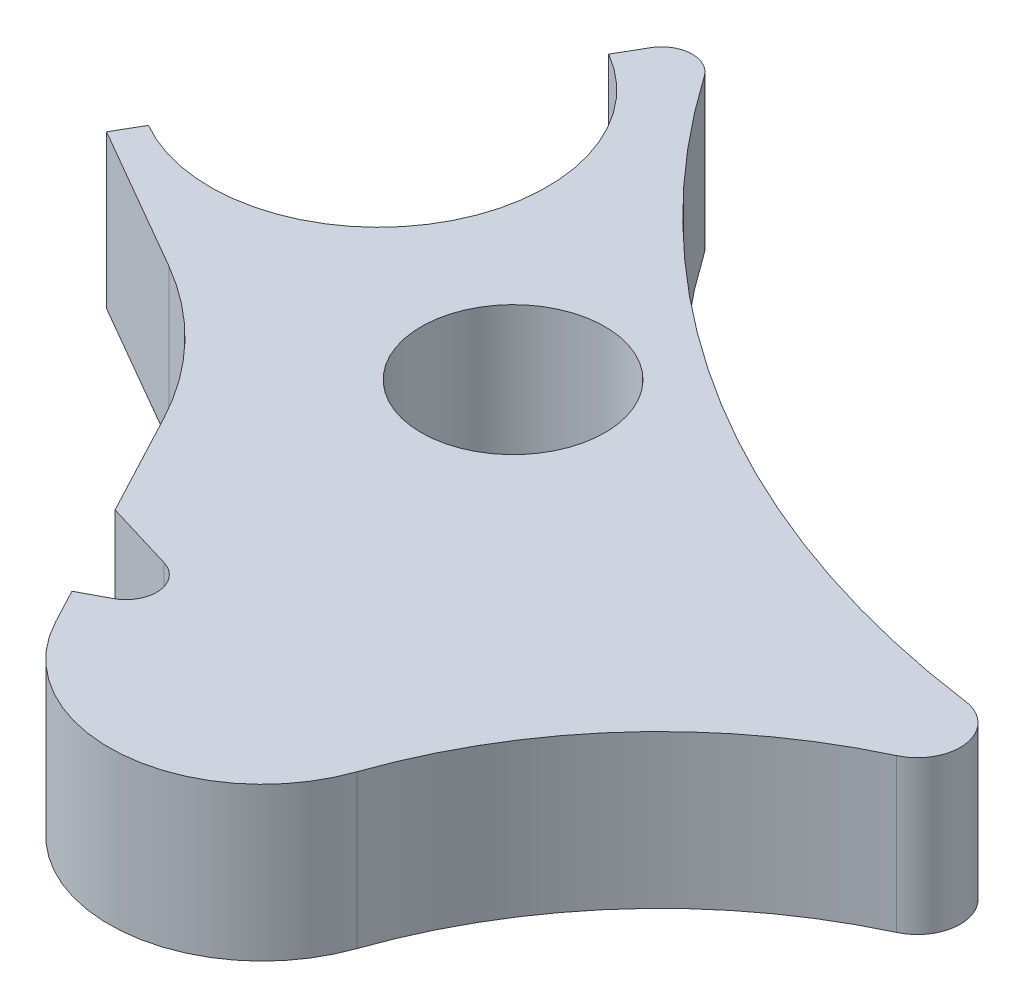
ISO-10303-21;
HEADER;
FILE_DESCRIPTION(('STEP AP214'),'2;1');
FILE_NAME('part.step','',(''),(''),'','','');
FILE_SCHEMA(('AUTOMOTIVE_DESIGN { 1 0 10303 214 1 1 1 1 }'));
ENDSEC;
DATA;
#1=APPLICATION_CONTEXT('core data for automotive mechanical design processes');
#2=APPLICATION_PROTOCOL_DEFINITION('international standard','automotive_design',2000,#1);
#3=PRODUCT_CONTEXT('',#1,'mechanical');
#4=PRODUCT('Part','Part','',(#3));
#5=PRODUCT_RELATED_PRODUCT_CATEGORY('part','',(#4));
#6=PRODUCT_DEFINITION_FORMATION('','',#4);
#7=PRODUCT_DEFINITION_CONTEXT('part definition',#1,'design');
#8=PRODUCT_DEFINITION('design','',#6,#7);
#9=PRODUCT_DEFINITION_SHAPE('','',#8);
#10=(LENGTH_UNIT() NAMED_UNIT(*) SI_UNIT(.MILLI.,.METRE.));
#11=(NAMED_UNIT(*) PLANE_ANGLE_UNIT() SI_UNIT($,.RADIAN.));
#12=(NAMED_UNIT(*) SI_UNIT($,.STERADIAN.) SOLID_ANGLE_UNIT());
#13=UNCERTAINTY_MEASURE_WITH_UNIT(LENGTH_MEASURE(1.E-05),#10,'distance_accuracy_value','');
#14=(GEOMETRIC_REPRESENTATION_CONTEXT(3) GLOBAL_UNCERTAINTY_ASSIGNED_CONTEXT((#13)) GLOBAL_UNIT_ASSIGNED_CONTEXT((#10,
#11,#12)) REPRESENTATION_CONTEXT('',''));
#15=CARTESIAN_POINT('',(0.,0.,0.));
#16=DIRECTION('',(0.,0.,1.));
#17=DIRECTION('',(1.,0.,0.));
#18=AXIS2_PLACEMENT_3D('',#15,#16,#17);
#19=CARTESIAN_POINT('',(-71.6834789839184,12.5,59.6498212203702));
#20=DIRECTION('',(0.,-1.,0.));
#21=DIRECTION('',(0.,0.,-1.));
#22=AXIS2_PLACEMENT_3D('',#19,#20,#21);
#23=CYLINDRICAL_SURFACE('',#22,55.);
#24=CARTESIAN_POINT('',(-71.6834789839184,-12.5,59.6498212203702));
#25=DIRECTION('',(0.,1.,0.));
#26=DIRECTION('',(0.,0.,1.));
#27=AXIS2_PLACEMENT_3D('',#24,#25,#26);
#28=CIRCLE('',#27,55.);
#29=CARTESIAN_POINT('',(-23.0980485474556,-12.5,33.8727781528725));
#30=VERTEX_POINT('',#29);
#31=CARTESIAN_POINT('',(-44.1834789839182,-12.5,12.0184240122262));
#32=VERTEX_POINT('',#31);
#33=EDGE_CURVE('E147',#30,#32,#28,.T.);
#34=ORIENTED_EDGE('',*,*,#33,.F.);
#35=DIRECTION('',(0.,-1.,0.));
#36=VECTOR('',#35,1.);
#37=CARTESIAN_POINT('',(-23.0980485474556,12.5,33.8727781528725));
#38=LINE('',#37,#36);
#39=CARTESIAN_POINT('',(-23.0980485474556,12.5,33.8727781528725));
#40=VERTEX_POINT('',#39);
#41=EDGE_CURVE('E141',#40,#30,#38,.T.);
#42=ORIENTED_EDGE('',*,*,#41,.F.);
#43=CARTESIAN_POINT('',(-71.6834789839184,12.5,59.6498212203702));
#44=DIRECTION('',(0.,1.,0.));
#45=DIRECTION('',(0.,0.,1.));
#46=AXIS2_PLACEMENT_3D('',#43,#44,#45);
#47=CIRCLE('',#46,55.);
#48=CARTESIAN_POINT('',(-44.1834789839182,12.5,12.0184240122262));
#49=VERTEX_POINT('',#48);
#50=EDGE_CURVE('E144',#40,#49,#47,.T.);
#51=ORIENTED_EDGE('',*,*,#50,.T.);
#52=DIRECTION('',(0.,-1.,0.));
#53=VECTOR('',#52,1.);
#54=CARTESIAN_POINT('',(-44.1834789839182,12.5,12.0184240122262));
#55=LINE('',#54,#53);
#56=EDGE_CURVE('E203',#49,#32,#55,.T.);
#57=ORIENTED_EDGE('',*,*,#56,.T.);
#58=EDGE_LOOP('',(#34,#42,#51,#57));
#59=FACE_BOUND('',#58,.T.);
#60=ADVANCED_FACE('F36',(#59),#23,.F.);
#61=CARTESIAN_POINT('',(-32.0482138145933,12.5,17.0032081698954));
#62=DIRECTION('',(0.883371462481142,0.,-0.46867351031814));
#63=DIRECTION('',(-0.46867351031814,0.,-0.883371462481142));
#64=AXIS2_PLACEMENT_3D('',#61,#62,#63);
#65=PLANE('',#64);
#66=DIRECTION('',(0.46867351031814,0.,0.883371462481143));
#67=VECTOR('',#66,1.);
#68=CARTESIAN_POINT('',(-32.0482138145933,-12.5,17.0032081698954));
#69=LINE('',#68,#67);
#70=CARTESIAN_POINT('',(-14.0638768142735,-12.5,50.9006863246606));
#71=VERTEX_POINT('',#70);
#72=EDGE_CURVE('E205',#30,#71,#69,.T.);
#73=ORIENTED_EDGE('',*,*,#72,.T.);
#74=DIRECTION('',(0.,-1.,0.));
#75=VECTOR('',#74,1.);
#76=CARTESIAN_POINT('',(-14.0638768142735,12.5,50.9006863246606));
#77=LINE('',#76,#75);
#78=CARTESIAN_POINT('',(-14.0638768142735,12.5,50.9006863246606));
#79=VERTEX_POINT('',#78);
#80=EDGE_CURVE('E151',#79,#71,#77,.T.);
#81=ORIENTED_EDGE('',*,*,#80,.F.);
#82=DIRECTION('',(0.46867351031814,0.,0.883371462481143));
#83=VECTOR('',#82,1.);
#84=CARTESIAN_POINT('',(-32.0482138145933,12.5,17.0032081698954));
#85=LINE('',#84,#83);
#86=EDGE_CURVE('E154',#40,#79,#85,.T.);
#87=ORIENTED_EDGE('',*,*,#86,.F.);
#88=ORIENTED_EDGE('',*,*,#41,.T.);
#89=EDGE_LOOP('',(#73,#81,#87,#88));
#90=FACE_BOUND('',#89,.T.);
#91=ADVANCED_FACE('F155',(#90),#65,.F.);
#92=CARTESIAN_POINT('',(-15.2694400899056,12.5,50.5364287650806));
#93=DIRECTION('',(0.289233034302246,0.,-0.957258717311217));
#94=DIRECTION('',(-0.957258717311217,0.,-0.289233034302246));
#95=AXIS2_PLACEMENT_3D('',#92,#93,#94);
#96=PLANE('',#95);
#97=DIRECTION('',(0.957258717311217,0.,0.289233034302246));
#98=VECTOR('',#97,1.);
#99=CARTESIAN_POINT('',(-15.2694400899056,-12.5,50.5364287650806));
#100=LINE('',#99,#98);
#101=CARTESIAN_POINT('',(-2.57677220653888,-12.5,54.3714827362875));
#102=VERTEX_POINT('',#101);
#103=EDGE_CURVE('E207',#71,#102,#100,.T.);
#104=ORIENTED_EDGE('',*,*,#103,.T.);
#105=DIRECTION('',(0.,-1.,0.));
#106=VECTOR('',#105,1.);
#107=CARTESIAN_POINT('',(-2.57677220653888,12.5,54.3714827362875));
#108=LINE('',#107,#106);
#109=CARTESIAN_POINT('',(-2.57677220653888,12.5,54.3714827362875));
#110=VERTEX_POINT('',#109);
#111=EDGE_CURVE('E261',#110,#102,#108,.T.);
#112=ORIENTED_EDGE('',*,*,#111,.F.);
#113=DIRECTION('',(0.957258717311217,0.,0.289233034302246));
#114=VECTOR('',#113,1.);
#115=CARTESIAN_POINT('',(-15.2694400899056,12.5,50.5364287650806));
#116=LINE('',#115,#114);
#117=EDGE_CURVE('E159',#79,#110,#116,.T.);
#118=ORIENTED_EDGE('',*,*,#117,.F.);
#119=ORIENTED_EDGE('',*,*,#80,.T.);
#120=EDGE_LOOP('',(#104,#112,#118,#119));
#121=FACE_BOUND('',#120,.T.);
#122=ADVANCED_FACE('F287',(#121),#96,.F.);
#123=CARTESIAN_POINT('',(-4.02293737805009,12.5,59.1577763228436));
#124=DIRECTION('',(0.,-1.,0.));
#125=DIRECTION('',(0.,0.,-1.));
#126=AXIS2_PLACEMENT_3D('',#123,#124,#125);
#127=CYLINDRICAL_SURFACE('',#126,4.99999999999999);
#128=CARTESIAN_POINT('',(-4.02293737805009,-12.5,59.1577763228436));
#129=DIRECTION('',(0.,1.,0.));
#130=DIRECTION('',(0.,0.,1.));
#131=AXIS2_PLACEMENT_3D('',#128,#129,#130);
#132=CIRCLE('',#131,4.99999999999999);
#133=CARTESIAN_POINT('',(-1.67956982645939,-12.5,63.5746336352493));
#134=VERTEX_POINT('',#133);
#135=EDGE_CURVE('E210',#134,#102,#132,.T.);
#136=ORIENTED_EDGE('',*,*,#135,.F.);
#137=DIRECTION('',(0.,-1.,0.));
#138=VECTOR('',#137,1.);
#139=CARTESIAN_POINT('',(-1.67956982645939,12.5,63.5746336352493));
#140=LINE('',#139,#138);
#141=CARTESIAN_POINT('',(-1.67956982645939,12.5,63.5746336352493));
#142=VERTEX_POINT('',#141);
#143=EDGE_CURVE('E259',#142,#134,#140,.T.);
#144=ORIENTED_EDGE('',*,*,#143,.F.);
#145=CARTESIAN_POINT('',(-4.02293737805009,12.5,59.1577763228436));
#146=DIRECTION('',(0.,1.,0.));
#147=DIRECTION('',(0.,0.,1.));
#148=AXIS2_PLACEMENT_3D('',#145,#146,#147);
#149=CIRCLE('',#148,4.99999999999999);
#150=EDGE_CURVE('E173',#142,#110,#149,.T.);
#151=ORIENTED_EDGE('',*,*,#150,.T.);
#152=ORIENTED_EDGE('',*,*,#111,.T.);
#153=EDGE_LOOP('',(#136,#144,#151,#152));
#154=FACE_BOUND('',#153,.T.);
#155=ADVANCED_FACE('F328',(#154),#127,.F.);
#156=CARTESIAN_POINT('',(25.9517866757282,12.5,48.9147930169447));
#157=DIRECTION('',(-0.468673510318138,0.,-0.883371462481143));
#158=DIRECTION('',(-0.883371462481143,0.,0.468673510318138));
#159=AXIS2_PLACEMENT_3D('',#156,#157,#158);
#160=PLANE('',#159);
#161=DIRECTION('',(0.883371462481143,0.,-0.468673510318138));
#162=VECTOR('',#161,1.);
#163=CARTESIAN_POINT('',(25.9517866757282,-12.5,48.9147930169447));
#164=LINE('',#163,#162);
#165=CARTESIAN_POINT('',(-6.0964271388651,-12.5,65.91800118684));
#166=VERTEX_POINT('',#165);
#167=EDGE_CURVE('E213',#166,#134,#164,.T.);
#168=ORIENTED_EDGE('',*,*,#167,.F.);
#169=DIRECTION('',(0.,-1.,0.));
#170=VECTOR('',#169,1.);
#171=CARTESIAN_POINT('',(-6.0964271388651,12.5,65.91800118684));
#172=LINE('',#171,#170);
#173=CARTESIAN_POINT('',(-6.0964271388651,12.5,65.91800118684));
#174=VERTEX_POINT('',#173);
#175=EDGE_CURVE('E257',#174,#166,#172,.T.);
#176=ORIENTED_EDGE('',*,*,#175,.F.);
#177=DIRECTION('',(0.883371462481143,0.,-0.468673510318138));
#178=VECTOR('',#177,1.);
#179=CARTESIAN_POINT('',(25.9517866757282,12.5,48.9147930169447));
#180=LINE('',#179,#178);
#181=EDGE_CURVE('E176',#174,#142,#180,.T.);
#182=ORIENTED_EDGE('',*,*,#181,.T.);
#183=ORIENTED_EDGE('',*,*,#143,.T.);
#184=EDGE_LOOP('',(#168,#176,#182,#183));
#185=FACE_BOUND('',#184,.T.);
#186=ADVANCED_FACE('F294',(#185),#160,.T.);
#187=CARTESIAN_POINT('',(-32.0482138145933,12.5,17.0032081698953));
#188=DIRECTION('',(0.883371462481143,0.,-0.46867351031814));
#189=DIRECTION('',(-0.46867351031814,0.,-0.883371462481143));
#190=AXIS2_PLACEMENT_3D('',#187,#188,#189);
#191=PLANE('',#190);
#192=DIRECTION('',(0.46867351031814,0.,0.883371462481143));
#193=VECTOR('',#192,1.);
#194=CARTESIAN_POINT('',(-32.0482138145933,-12.5,17.0032081698953));
#195=LINE('',#194,#193);
#196=CARTESIAN_POINT('',(-3.01984926989983,-12.5,71.7168377579535));
#197=VERTEX_POINT('',#196);
#198=EDGE_CURVE('E216',#166,#197,#195,.T.);
#199=ORIENTED_EDGE('',*,*,#198,.T.);
#200=DIRECTION('',(0.,-1.,0.));
#201=VECTOR('',#200,1.);
#202=CARTESIAN_POINT('',(-3.01984926989983,12.5,71.7168377579535));
#203=LINE('',#202,#201);
#204=CARTESIAN_POINT('',(-3.01984926989983,12.5,71.7168377579535));
#205=VERTEX_POINT('',#204);
#206=EDGE_CURVE('E254',#205,#197,#203,.T.);
#207=ORIENTED_EDGE('',*,*,#206,.F.);
#208=DIRECTION('',(0.46867351031814,0.,0.883371462481143));
#209=VECTOR('',#208,1.);
#210=CARTESIAN_POINT('',(-32.0482138145933,12.5,17.0032081698953));
#211=LINE('',#210,#209);
#212=EDGE_CURVE('E179',#174,#205,#211,.T.);
#213=ORIENTED_EDGE('',*,*,#212,.F.);
#214=ORIENTED_EDGE('',*,*,#175,.T.);
#215=EDGE_LOOP('',(#199,#207,#213,#214));
#216=FACE_BOUND('',#215,.T.);
#217=ADVANCED_FACE('F300',(#216),#191,.F.);
#218=CARTESIAN_POINT('',(19.0644372921287,12.5,60.));
#219=DIRECTION('',(0.,-1.,0.));
#220=DIRECTION('',(0.,0.,-1.));
#221=AXIS2_PLACEMENT_3D('',#218,#219,#220);
#222=CYLINDRICAL_SURFACE('',#221,25.);
#223=CARTESIAN_POINT('',(19.0644372921287,-12.5,60.));
#224=DIRECTION('',(0.,1.,0.));
#225=DIRECTION('',(0.,0.,1.));
#226=AXIS2_PLACEMENT_3D('',#223,#224,#225);
#227=CIRCLE('',#226,25.);
#228=CARTESIAN_POINT('',(42.6898014399939,-12.5,68.1757060172665));
#229=VERTEX_POINT('',#228);
#230=EDGE_CURVE('E218',#197,#229,#227,.T.);
#231=ORIENTED_EDGE('',*,*,#230,.T.);
#232=DIRECTION('',(0.,-1.,0.));
#233=VECTOR('',#232,1.);
#234=CARTESIAN_POINT('',(42.6898014399939,12.5,68.1757060172665));
#235=LINE('',#234,#233);
#236=CARTESIAN_POINT('',(42.6898014399939,12.5,68.1757060172665));
#237=VERTEX_POINT('',#236);
#238=EDGE_CURVE('E252',#237,#229,#235,.T.);
#239=ORIENTED_EDGE('',*,*,#238,.F.);
#240=CARTESIAN_POINT('',(19.0644372921287,12.5,60.));
#241=DIRECTION('',(0.,1.,0.));
#242=DIRECTION('',(0.,0.,1.));
#243=AXIS2_PLACEMENT_3D('',#240,#241,#242);
#244=CIRCLE('',#243,25.);
#245=EDGE_CURVE('E181',#205,#237,#244,.T.);
#246=ORIENTED_EDGE('',*,*,#245,.F.);
#247=ORIENTED_EDGE('',*,*,#206,.T.);
#248=EDGE_LOOP('',(#231,#239,#246,#247));
#249=FACE_BOUND('',#248,.T.);
#250=ADVANCED_FACE('F305',(#249),#222,.T.);
#251=CARTESIAN_POINT('',(118.290966713162,12.5,94.3379652725194));
#252=DIRECTION('',(0.,-1.,0.));
#253=DIRECTION('',(0.,0.,-1.));
#254=AXIS2_PLACEMENT_3D('',#251,#252,#253);
#255=CYLINDRICAL_SURFACE('',#254,80.);
#256=CARTESIAN_POINT('',(118.290966713162,-12.5,94.3379652725194));
#257=DIRECTION('',(0.,1.,0.));
#258=DIRECTION('',(0.,0.,1.));
#259=AXIS2_PLACEMENT_3D('',#256,#257,#258);
#260=CIRCLE('',#259,80.);
#261=CARTESIAN_POINT('',(84.4601927240476,-12.5,21.8432845621567));
#262=VERTEX_POINT('',#261);
#263=EDGE_CURVE('E221',#262,#229,#260,.T.);
#264=ORIENTED_EDGE('',*,*,#263,.F.);
#265=DIRECTION('',(0.,-1.,0.));
#266=VECTOR('',#265,1.);
#267=CARTESIAN_POINT('',(84.4601927240476,12.5,21.8432845621567));
#268=LINE('',#267,#266);
#269=CARTESIAN_POINT('',(84.4601927240476,12.5,21.8432845621567));
#270=VERTEX_POINT('',#269);
#271=EDGE_CURVE('E250',#270,#262,#268,.T.);
#272=ORIENTED_EDGE('',*,*,#271,.F.);
#273=CARTESIAN_POINT('',(118.290966713162,12.5,94.3379652725194));
#274=DIRECTION('',(0.,1.,0.));
#275=DIRECTION('',(0.,0.,1.));
#276=AXIS2_PLACEMENT_3D('',#273,#274,#275);
#277=CIRCLE('',#276,80.);
#278=EDGE_CURVE('E183',#270,#237,#277,.T.);
#279=ORIENTED_EDGE('',*,*,#278,.T.);
#280=ORIENTED_EDGE('',*,*,#238,.T.);
#281=EDGE_LOOP('',(#264,#272,#279,#280));
#282=FACE_BOUND('',#281,.T.);
#283=ADVANCED_FACE('F309',(#282),#255,.F.);
#284=CARTESIAN_POINT('',(81.5,12.5,15.5));
#285=DIRECTION('',(0.,-1.,0.));
#286=DIRECTION('',(0.,0.,-1.));
#287=AXIS2_PLACEMENT_3D('',#284,#285,#286);
#288=CYLINDRICAL_SURFACE('',#287,7.00000000000003);
#289=CARTESIAN_POINT('',(81.5,-12.5,15.5));
#290=DIRECTION('',(0.,1.,0.));
#291=DIRECTION('',(0.,0.,1.));
#292=AXIS2_PLACEMENT_3D('',#289,#290,#291);
#293=CIRCLE('',#292,7.00000000000003);
#294=CARTESIAN_POINT('',(82.4423736641705,-12.5,8.56372348611456));
#295=VERTEX_POINT('',#294);
#296=EDGE_CURVE('E224',#262,#295,#293,.T.);
#297=ORIENTED_EDGE('',*,*,#296,.T.);
#298=DIRECTION('',(0.,-1.,0.));
#299=VECTOR('',#298,1.);
#300=CARTESIAN_POINT('',(82.4423736641705,12.5,8.56372348611456));
#301=LINE('',#300,#299);
#302=CARTESIAN_POINT('',(82.4423736641705,12.5,8.56372348611456));
#303=VERTEX_POINT('',#302);
#304=EDGE_CURVE('E247',#303,#295,#301,.T.);
#305=ORIENTED_EDGE('',*,*,#304,.F.);
#306=CARTESIAN_POINT('',(81.5,12.5,15.5));
#307=DIRECTION('',(0.,1.,0.));
#308=DIRECTION('',(0.,0.,1.));
#309=AXIS2_PLACEMENT_3D('',#306,#307,#308);
#310=CIRCLE('',#309,7.00000000000003);
#311=EDGE_CURVE('E186',#270,#303,#310,.T.);
#312=ORIENTED_EDGE('',*,*,#311,.F.);
#313=ORIENTED_EDGE('',*,*,#271,.T.);
#314=EDGE_LOOP('',(#297,#305,#312,#313));
#315=FACE_BOUND('',#314,.T.);
#316=ADVANCED_FACE('F314',(#315),#288,.T.);
#317=CARTESIAN_POINT('',(103.982343130924,12.5,-149.979739688408));
#318=DIRECTION('',(0.,-1.,0.));
#319=DIRECTION('',(0.,0.,-1.));
#320=AXIS2_PLACEMENT_3D('',#317,#318,#319);
#321=CYLINDRICAL_SURFACE('',#320,160.);
#322=CARTESIAN_POINT('',(103.982343130924,-12.5,-149.979739688408));
#323=DIRECTION('',(0.,1.,0.));
#324=DIRECTION('',(0.,0.,1.));
#325=AXIS2_PLACEMENT_3D('',#322,#323,#324);
#326=CIRCLE('',#325,160.);
#327=CARTESIAN_POINT('',(-27.2839617128956,-12.5,-58.4966417268212));
#328=VERTEX_POINT('',#327);
#329=EDGE_CURVE('E227',#328,#295,#326,.T.);
#330=ORIENTED_EDGE('',*,*,#329,.F.);
#331=DIRECTION('',(0.,-1.,0.));
#332=VECTOR('',#331,1.);
#333=CARTESIAN_POINT('',(-27.2839617128957,12.5,-58.4966417268212));
#334=LINE('',#333,#332);
#335=CARTESIAN_POINT('',(-27.2839617128956,12.5,-58.4966417268212));
#336=VERTEX_POINT('',#335);
#337=EDGE_CURVE('E44',#328,#336,#334,.F.);
#338=ORIENTED_EDGE('',*,*,#337,.T.);
#339=CARTESIAN_POINT('',(103.982343130924,12.5,-149.979739688408));
#340=DIRECTION('',(0.,1.,0.));
#341=DIRECTION('',(0.,0.,1.));
#342=AXIS2_PLACEMENT_3D('',#339,#340,#341);
#343=CIRCLE('',#342,160.);
#344=EDGE_CURVE('E189',#336,#303,#343,.T.);
#345=ORIENTED_EDGE('',*,*,#344,.T.);
#346=ORIENTED_EDGE('',*,*,#304,.T.);
#347=EDGE_LOOP('',(#330,#338,#345,#346));
#348=FACE_BOUND('',#347,.T.);
#349=ADVANCED_FACE('F341',(#348),#321,.F.);
#350=CARTESIAN_POINT('',(-51.9615242270662,12.5,-30.0000000000005));
#351=DIRECTION('',(0.866025403784435,0.,0.500000000000007));
#352=DIRECTION('',(0.500000000000007,0.,-0.866025403784435));
#353=AXIS2_PLACEMENT_3D('',#350,#351,#352);
#354=PLANE('',#353);
#355=DIRECTION('',(-0.500000000000007,0.,0.866025403784435));
#356=VECTOR('',#355,1.);
#357=CARTESIAN_POINT('',(-51.9615242270662,12.5,-30.0000000000005));
#358=LINE('',#357,#356);
#359=CARTESIAN_POINT('',(-35.7161607581872,12.5,-58.1377949155217));
#360=VERTEX_POINT('',#359);
#361=CARTESIAN_POINT('',(-38.2115242270661,12.5,-53.8156986040722));
#362=VERTEX_POINT('',#361);
#363=EDGE_CURVE('E191',#360,#362,#358,.T.);
#364=ORIENTED_EDGE('',*,*,#363,.F.);
#365=DIRECTION('',(0.,1.,0.));
#366=VECTOR('',#365,1.);
#367=CARTESIAN_POINT('',(-35.7161607581872,-12.5,-58.1377949155217));
#368=LINE('',#367,#366);
#369=CARTESIAN_POINT('',(-35.7161607581872,-12.5,-58.1377949155217));
#370=VERTEX_POINT('',#369);
#371=EDGE_CURVE('E150',#360,#370,#368,.F.);
#372=ORIENTED_EDGE('',*,*,#371,.T.);
#373=DIRECTION('',(-0.500000000000007,0.,0.866025403784435));
#374=VECTOR('',#373,1.);
#375=CARTESIAN_POINT('',(-51.9615242270662,-12.5,-30.0000000000005));
#376=LINE('',#375,#374);
#377=CARTESIAN_POINT('',(-38.2115242270661,-12.5,-53.8156986040722));
#378=VERTEX_POINT('',#377);
#379=EDGE_CURVE('E229',#370,#378,#376,.T.);
#380=ORIENTED_EDGE('',*,*,#379,.T.);
#381=DIRECTION('',(0.,-1.,0.));
#382=VECTOR('',#381,1.);
#383=CARTESIAN_POINT('',(-38.2115242270661,12.5,-53.8156986040722));
#384=LINE('',#383,#382);
#385=EDGE_CURVE('E244',#362,#378,#384,.T.);
#386=ORIENTED_EDGE('',*,*,#385,.F.);
#387=EDGE_LOOP('',(#364,#372,#380,#386));
#388=FACE_BOUND('',#387,.T.);
#389=ADVANCED_FACE('F269',(#388),#354,.F.);
#390=CARTESIAN_POINT('',(-51.9615242270662,12.5,-30.0000000000002));
#391=DIRECTION('',(0.,-1.,0.));
#392=DIRECTION('',(0.,0.,-1.));
#393=AXIS2_PLACEMENT_3D('',#390,#391,#392);
#394=CYLINDRICAL_SURFACE('',#393,27.5);
#395=CARTESIAN_POINT('',(-51.9615242270662,-12.5,-30.0000000000002));
#396=DIRECTION('',(0.,1.,0.));
#397=DIRECTION('',(0.,0.,1.));
#398=AXIS2_PLACEMENT_3D('',#395,#396,#397);
#399=CIRCLE('',#398,27.5);
#400=CARTESIAN_POINT('',(-65.7115242270663,-12.5,-6.18430139592822));
#401=VERTEX_POINT('',#400);
#402=EDGE_CURVE('E231',#401,#378,#399,.T.);
#403=ORIENTED_EDGE('',*,*,#402,.F.);
#404=DIRECTION('',(0.,-1.,0.));
#405=VECTOR('',#404,1.);
#406=CARTESIAN_POINT('',(-65.7115242270663,12.5,-6.18430139592822));
#407=LINE('',#406,#405);
#408=CARTESIAN_POINT('',(-65.7115242270663,12.5,-6.18430139592822));
#409=VERTEX_POINT('',#408);
#410=EDGE_CURVE('E242',#409,#401,#407,.T.);
#411=ORIENTED_EDGE('',*,*,#410,.F.);
#412=CARTESIAN_POINT('',(-51.9615242270662,12.5,-30.0000000000002));
#413=DIRECTION('',(0.,1.,0.));
#414=DIRECTION('',(0.,0.,1.));
#415=AXIS2_PLACEMENT_3D('',#412,#413,#414);
#416=CIRCLE('',#415,27.5);
#417=EDGE_CURVE('E193',#409,#362,#416,.T.);
#418=ORIENTED_EDGE('',*,*,#417,.T.);
#419=ORIENTED_EDGE('',*,*,#385,.T.);
#420=EDGE_LOOP('',(#403,#411,#418,#419));
#421=FACE_BOUND('',#420,.T.);
#422=ADVANCED_FACE('F278',(#421),#394,.F.);
#423=CARTESIAN_POINT('',(-51.961524227066,12.5,-30.0000000000003));
#424=DIRECTION('',(-0.866025403784435,0.,-0.500000000000006));
#425=DIRECTION('',(-0.500000000000006,0.,0.866025403784435));
#426=AXIS2_PLACEMENT_3D('',#423,#424,#425);
#427=PLANE('',#426);
#428=DIRECTION('',(0.500000000000006,0.,-0.866025403784435));
#429=VECTOR('',#428,1.);
#430=CARTESIAN_POINT('',(-51.961524227066,-12.5,-30.0000000000003));
#431=LINE('',#430,#429);
#432=CARTESIAN_POINT('',(-68.2115242270663,-12.5,-1.85417437700604));
#433=VERTEX_POINT('',#432);
#434=EDGE_CURVE('E234',#433,#401,#431,.T.);
#435=ORIENTED_EDGE('',*,*,#434,.F.);
#436=DIRECTION('',(0.,-1.,0.));
#437=VECTOR('',#436,1.);
#438=CARTESIAN_POINT('',(-68.2115242270663,12.5,-1.85417437700604));
#439=LINE('',#438,#437);
#440=CARTESIAN_POINT('',(-68.2115242270663,12.5,-1.85417437700604));
#441=VERTEX_POINT('',#440);
#442=EDGE_CURVE('E240',#441,#433,#439,.T.);
#443=ORIENTED_EDGE('',*,*,#442,.F.);
#444=DIRECTION('',(0.500000000000006,0.,-0.866025403784435));
#445=VECTOR('',#444,1.);
#446=CARTESIAN_POINT('',(-51.961524227066,12.5,-30.0000000000003));
#447=LINE('',#446,#445);
#448=EDGE_CURVE('E196',#441,#409,#447,.T.);
#449=ORIENTED_EDGE('',*,*,#448,.T.);
#450=ORIENTED_EDGE('',*,*,#410,.T.);
#451=EDGE_LOOP('',(#435,#443,#449,#450));
#452=FACE_BOUND('',#451,.T.);
#453=ADVANCED_FACE('F281',(#452),#427,.T.);
#454=CARTESIAN_POINT('',(-16.2500000000001,12.5,28.1458256229942));
#455=DIRECTION('',(-0.500000000000004,0.,0.866025403784436));
#456=DIRECTION('',(0.866025403784436,0.,0.500000000000004));
#457=AXIS2_PLACEMENT_3D('',#454,#455,#456);
#458=PLANE('',#457);
#459=DIRECTION('',(-0.866025403784436,0.,-0.500000000000004));
#460=VECTOR('',#459,1.);
#461=CARTESIAN_POINT('',(-16.2500000000001,-12.5,28.1458256229942));
#462=LINE('',#461,#460);
#463=EDGE_CURVE('E169',#32,#433,#462,.T.);
#464=ORIENTED_EDGE('',*,*,#463,.F.);
#465=ORIENTED_EDGE('',*,*,#56,.F.);
#466=DIRECTION('',(-0.866025403784436,0.,-0.500000000000004));
#467=VECTOR('',#466,1.);
#468=CARTESIAN_POINT('',(-16.2500000000001,12.5,28.1458256229942));
#469=LINE('',#468,#467);
#470=EDGE_CURVE('E165',#49,#441,#469,.T.);
#471=ORIENTED_EDGE('',*,*,#470,.T.);
#472=ORIENTED_EDGE('',*,*,#442,.T.);
#473=EDGE_LOOP('',(#464,#465,#471,#472));
#474=FACE_BOUND('',#473,.T.);
#475=ADVANCED_FACE('F284',(#474),#458,.T.);
#476=CARTESIAN_POINT('',(0.,12.5,0.));
#477=DIRECTION('',(0.,-1.,0.));
#478=DIRECTION('',(0.,0.,-1.));
#479=AXIS2_PLACEMENT_3D('',#476,#477,#478);
#480=CYLINDRICAL_SURFACE('',#479,15.);
#481=CARTESIAN_POINT('',(0.,12.5,0.));
#482=DIRECTION('',(0.,1.,0.));
#483=DIRECTION('',(0.,0.,1.));
#484=AXIS2_PLACEMENT_3D('',#481,#482,#483);
#485=CIRCLE('',#484,15.);
#486=CARTESIAN_POINT('',(0.,12.5,15.));
#487=VERTEX_POINT('',#486);
#488=EDGE_CURVE('E200',#487,#487,#485,.T.);
#489=ORIENTED_EDGE('',*,*,#488,.T.);
#490=EDGE_LOOP('',(#489));
#491=FACE_BOUND('',#490,.T.);
#492=CARTESIAN_POINT('',(0.,-12.5,0.));
#493=DIRECTION('',(0.,1.,0.));
#494=DIRECTION('',(0.,0.,1.));
#495=AXIS2_PLACEMENT_3D('',#492,#493,#494);
#496=CIRCLE('',#495,15.);
#497=CARTESIAN_POINT('',(0.,-12.5,15.));
#498=VERTEX_POINT('',#497);
#499=EDGE_CURVE('E166',#498,#498,#496,.T.);
#500=ORIENTED_EDGE('',*,*,#499,.F.);
#501=EDGE_LOOP('',(#500));
#502=FACE_BOUND('',#501,.T.);
#503=ADVANCED_FACE('F352',(#491,#502),#480,.F.);
#504=CARTESIAN_POINT('',(0.,12.5,0.));
#505=DIRECTION('',(0.,1.,0.));
#506=DIRECTION('',(0.,0.,1.));
#507=AXIS2_PLACEMENT_3D('',#504,#505,#506);
#508=PLANE('',#507);
#509=ORIENTED_EDGE('',*,*,#344,.F.);
#510=CARTESIAN_POINT('',(-31.386033739265,12.5,-55.6377949155216));
#511=DIRECTION('',(0.,1.,0.));
#512=DIRECTION('',(0.,0.,1.));
#513=AXIS2_PLACEMENT_3D('',#510,#511,#512);
#514=CIRCLE('',#513,5.);
#515=EDGE_CURVE('E11',#336,#360,#514,.T.);
#516=ORIENTED_EDGE('',*,*,#515,.T.);
#517=ORIENTED_EDGE('',*,*,#363,.T.);
#518=ORIENTED_EDGE('',*,*,#417,.F.);
#519=ORIENTED_EDGE('',*,*,#448,.F.);
#520=ORIENTED_EDGE('',*,*,#470,.F.);
#521=ORIENTED_EDGE('',*,*,#50,.F.);
#522=ORIENTED_EDGE('',*,*,#86,.T.);
#523=ORIENTED_EDGE('',*,*,#117,.T.);
#524=ORIENTED_EDGE('',*,*,#150,.F.);
#525=ORIENTED_EDGE('',*,*,#181,.F.);
#526=ORIENTED_EDGE('',*,*,#212,.T.);
#527=ORIENTED_EDGE('',*,*,#245,.T.);
#528=ORIENTED_EDGE('',*,*,#278,.F.);
#529=ORIENTED_EDGE('',*,*,#311,.T.);
#530=EDGE_LOOP('',(#509,#516,#517,#518,#519,#520,#521,#522,#523,#524,#525,#526,#527,#528,#529));
#531=FACE_BOUND('',#530,.T.);
#532=ORIENTED_EDGE('',*,*,#488,.F.);
#533=EDGE_LOOP('',(#532));
#534=FACE_BOUND('',#533,.T.);
#535=ADVANCED_FACE('F161',(#531,#534),#508,.T.);
#536=CARTESIAN_POINT('',(0.,-12.5,0.));
#537=DIRECTION('',(0.,1.,0.));
#538=DIRECTION('',(0.,0.,1.));
#539=AXIS2_PLACEMENT_3D('',#536,#537,#538);
#540=PLANE('',#539);
#541=ORIENTED_EDGE('',*,*,#379,.F.);
#542=CARTESIAN_POINT('',(-31.386033739265,-12.5,-55.6377949155216));
#543=DIRECTION('',(0.,1.,0.));
#544=DIRECTION('',(0.,0.,1.));
#545=AXIS2_PLACEMENT_3D('',#542,#543,#544);
#546=CIRCLE('',#545,5.);
#547=EDGE_CURVE('E58',#370,#328,#546,.F.);
#548=ORIENTED_EDGE('',*,*,#547,.T.);
#549=ORIENTED_EDGE('',*,*,#329,.T.);
#550=ORIENTED_EDGE('',*,*,#296,.F.);
#551=ORIENTED_EDGE('',*,*,#263,.T.);
#552=ORIENTED_EDGE('',*,*,#230,.F.);
#553=ORIENTED_EDGE('',*,*,#198,.F.);
#554=ORIENTED_EDGE('',*,*,#167,.T.);
#555=ORIENTED_EDGE('',*,*,#135,.T.);
#556=ORIENTED_EDGE('',*,*,#103,.F.);
#557=ORIENTED_EDGE('',*,*,#72,.F.);
#558=ORIENTED_EDGE('',*,*,#33,.T.);
#559=ORIENTED_EDGE('',*,*,#463,.T.);
#560=ORIENTED_EDGE('',*,*,#434,.T.);
#561=ORIENTED_EDGE('',*,*,#402,.T.);
#562=EDGE_LOOP('',(#541,#548,#549,#550,#551,#552,#553,#554,#555,#556,#557,#558,#559,#560,#561));
#563=FACE_BOUND('',#562,.T.);
#564=ORIENTED_EDGE('',*,*,#499,.T.);
#565=EDGE_LOOP('',(#564));
#566=FACE_BOUND('',#565,.T.);
#567=ADVANCED_FACE('F273',(#563,#566),#540,.F.);
#568=CARTESIAN_POINT('',(-31.386033739265,12.5,-55.6377949155216));
#569=DIRECTION('',(0.,-1.,0.));
#570=DIRECTION('',(0.,0.,-1.));
#571=AXIS2_PLACEMENT_3D('',#568,#569,#570);
#572=CYLINDRICAL_SURFACE('',#571,5.);
#573=ORIENTED_EDGE('',*,*,#515,.F.);
#574=ORIENTED_EDGE('',*,*,#337,.F.);
#575=ORIENTED_EDGE('',*,*,#547,.F.);
#576=ORIENTED_EDGE('',*,*,#371,.F.);
#577=EDGE_LOOP('',(#573,#574,#575,#576));
#578=FACE_BOUND('',#577,.T.);
#579=ADVANCED_FACE('F38',(#578),#572,.T.);
#580=CLOSED_SHELL('',(#60,#91,#122,#155,#186,#217,#250,#283,#316,#349,#389,#422,#453,#475,#503,
#535,#567,#579));
#581=MANIFOLD_SOLID_BREP('B2',#580);
#582=ADVANCED_BREP_SHAPE_REPRESENTATION('',(#18,#581),#14);
#583=SHAPE_DEFINITION_REPRESENTATION(#9,#582);
ENDSEC;
END-ISO-10303-21;
